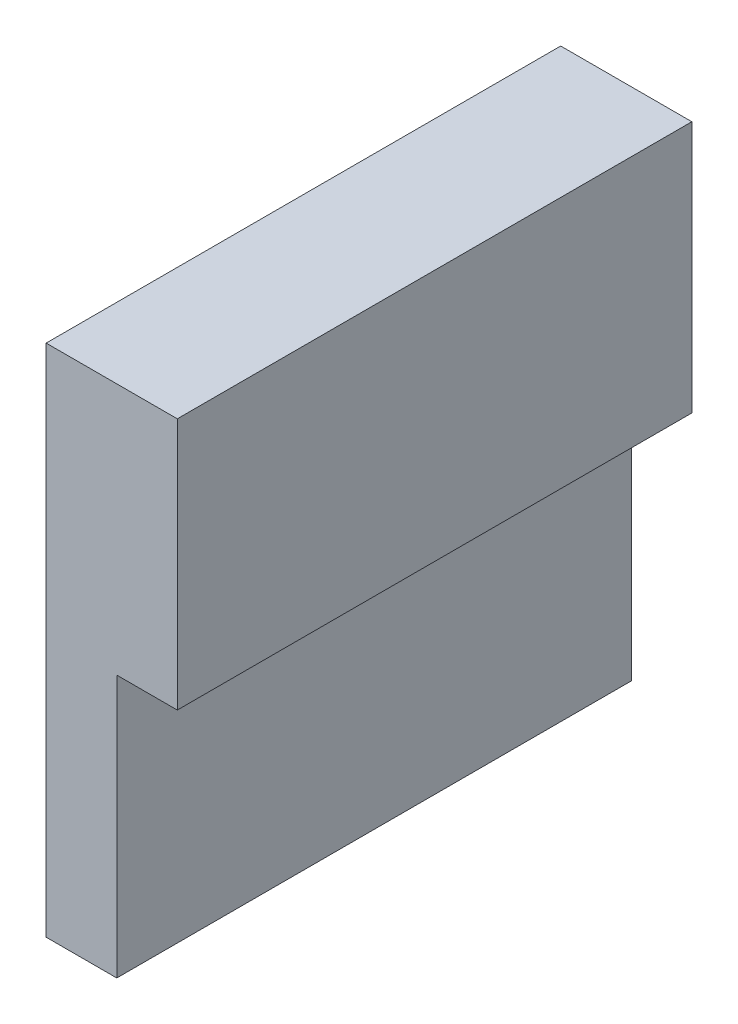
ISO-10303-21;
HEADER;
FILE_DESCRIPTION(('STEP AP214'),'2;1');
FILE_NAME('part.step','',(''),(''),'','','');
FILE_SCHEMA(('AUTOMOTIVE_DESIGN { 1 0 10303 214 1 1 1 1 }'));
ENDSEC;
DATA;
#1=APPLICATION_CONTEXT('core data for automotive mechanical design processes');
#2=APPLICATION_PROTOCOL_DEFINITION('international standard','automotive_design',2000,#1);
#3=PRODUCT_CONTEXT('',#1,'mechanical');
#4=PRODUCT('Part','Part','',(#3));
#5=PRODUCT_RELATED_PRODUCT_CATEGORY('part','',(#4));
#6=PRODUCT_DEFINITION_FORMATION('','',#4);
#7=PRODUCT_DEFINITION_CONTEXT('part definition',#1,'design');
#8=PRODUCT_DEFINITION('design','',#6,#7);
#9=PRODUCT_DEFINITION_SHAPE('','',#8);
#10=(LENGTH_UNIT() NAMED_UNIT(*) SI_UNIT(.MILLI.,.METRE.));
#11=(NAMED_UNIT(*) PLANE_ANGLE_UNIT() SI_UNIT($,.RADIAN.));
#12=(NAMED_UNIT(*) SI_UNIT($,.STERADIAN.) SOLID_ANGLE_UNIT());
#13=UNCERTAINTY_MEASURE_WITH_UNIT(LENGTH_MEASURE(1.E-05),#10,'distance_accuracy_value','');
#14=(GEOMETRIC_REPRESENTATION_CONTEXT(3) GLOBAL_UNCERTAINTY_ASSIGNED_CONTEXT((#13)) GLOBAL_UNIT_ASSIGNED_CONTEXT((#10,
#11,#12)) REPRESENTATION_CONTEXT('',''));
#15=CARTESIAN_POINT('',(0.,0.,0.));
#16=DIRECTION('',(0.,0.,1.));
#17=DIRECTION('',(1.,0.,0.));
#18=AXIS2_PLACEMENT_3D('',#15,#16,#17);
#19=CARTESIAN_POINT('',(13.,0.,0.));
#20=DIRECTION('',(0.,0.,1.));
#21=DIRECTION('',(0.,-1.,0.));
#22=AXIS2_PLACEMENT_3D('',#19,#20,#21);
#23=PLANE('',#22);
#24=DIRECTION('',(0.,1.,0.));
#25=VECTOR('',#24,1.);
#26=CARTESIAN_POINT('',(13.,0.,0.));
#27=LINE('',#26,#25);
#28=CARTESIAN_POINT('',(13.,-25.,0.));
#29=VERTEX_POINT('',#28);
#30=CARTESIAN_POINT('',(13.,0.,0.));
#31=VERTEX_POINT('',#30);
#32=EDGE_CURVE('E105',#29,#31,#27,.T.);
#33=ORIENTED_EDGE('',*,*,#32,.F.);
#34=DIRECTION('',(1.,0.,0.));
#35=VECTOR('',#34,1.);
#36=CARTESIAN_POINT('',(7.,-25.,0.));
#37=LINE('',#36,#35);
#38=CARTESIAN_POINT('',(7.,-25.,0.));
#39=VERTEX_POINT('',#38);
#40=EDGE_CURVE('E53',#39,#29,#37,.T.);
#41=ORIENTED_EDGE('',*,*,#40,.F.);
#42=DIRECTION('',(0.,1.,0.));
#43=VECTOR('',#42,1.);
#44=CARTESIAN_POINT('',(7.,-51.,0.));
#45=LINE('',#44,#43);
#46=CARTESIAN_POINT('',(7.,-51.,0.));
#47=VERTEX_POINT('',#46);
#48=EDGE_CURVE('E90',#47,#39,#45,.T.);
#49=ORIENTED_EDGE('',*,*,#48,.F.);
#50=DIRECTION('',(-1.,0.,0.));
#51=VECTOR('',#50,1.);
#52=CARTESIAN_POINT('',(13.,-51.,0.));
#53=LINE('',#52,#51);
#54=CARTESIAN_POINT('',(0.,-51.,0.));
#55=VERTEX_POINT('',#54);
#56=EDGE_CURVE('E82',#47,#55,#53,.T.);
#57=ORIENTED_EDGE('',*,*,#56,.T.);
#58=DIRECTION('',(0.,1.,0.));
#59=VECTOR('',#58,1.);
#60=CARTESIAN_POINT('',(0.,0.,0.));
#61=LINE('',#60,#59);
#62=CARTESIAN_POINT('',(0.,0.,0.));
#63=VERTEX_POINT('',#62);
#64=EDGE_CURVE('E87',#55,#63,#61,.T.);
#65=ORIENTED_EDGE('',*,*,#64,.T.);
#66=DIRECTION('',(-1.,0.,0.));
#67=VECTOR('',#66,1.);
#68=CARTESIAN_POINT('',(13.,0.,0.));
#69=LINE('',#68,#67);
#70=EDGE_CURVE('E11',#31,#63,#69,.T.);
#71=ORIENTED_EDGE('',*,*,#70,.F.);
#72=EDGE_LOOP('',(#33,#41,#49,#57,#65,#71));
#73=FACE_BOUND('',#72,.T.);
#74=ADVANCED_FACE('F38',(#73),#23,.F.);
#75=CARTESIAN_POINT('',(13.,0.,0.));
#76=DIRECTION('',(0.,-1.,0.));
#77=DIRECTION('',(0.,0.,-1.));
#78=AXIS2_PLACEMENT_3D('',#75,#76,#77);
#79=PLANE('',#78);
#80=DIRECTION('',(0.,0.,1.));
#81=VECTOR('',#80,1.);
#82=CARTESIAN_POINT('',(0.,0.,0.));
#83=LINE('',#82,#81);
#84=CARTESIAN_POINT('',(0.,0.,51.));
#85=VERTEX_POINT('',#84);
#86=EDGE_CURVE('E109',#63,#85,#83,.T.);
#87=ORIENTED_EDGE('',*,*,#86,.T.);
#88=DIRECTION('',(-1.,0.,0.));
#89=VECTOR('',#88,1.);
#90=CARTESIAN_POINT('',(13.,0.,51.));
#91=LINE('',#90,#89);
#92=CARTESIAN_POINT('',(13.,0.,51.));
#93=VERTEX_POINT('',#92);
#94=EDGE_CURVE('E46',#93,#85,#91,.T.);
#95=ORIENTED_EDGE('',*,*,#94,.F.);
#96=DIRECTION('',(0.,0.,1.));
#97=VECTOR('',#96,1.);
#98=CARTESIAN_POINT('',(13.,0.,0.));
#99=LINE('',#98,#97);
#100=EDGE_CURVE('E62',#31,#93,#99,.T.);
#101=ORIENTED_EDGE('',*,*,#100,.F.);
#102=ORIENTED_EDGE('',*,*,#70,.T.);
#103=EDGE_LOOP('',(#87,#95,#101,#102));
#104=FACE_BOUND('',#103,.T.);
#105=ADVANCED_FACE('F131',(#104),#79,.F.);
#106=CARTESIAN_POINT('',(13.,0.,51.));
#107=DIRECTION('',(0.,0.,-1.));
#108=DIRECTION('',(-1.,0.,0.));
#109=AXIS2_PLACEMENT_3D('',#106,#107,#108);
#110=PLANE('',#109);
#111=DIRECTION('',(0.,-1.,0.));
#112=VECTOR('',#111,1.);
#113=CARTESIAN_POINT('',(7.,-51.,51.));
#114=LINE('',#113,#112);
#115=CARTESIAN_POINT('',(7.,-25.,51.));
#116=VERTEX_POINT('',#115);
#117=CARTESIAN_POINT('',(7.,-51.,51.));
#118=VERTEX_POINT('',#117);
#119=EDGE_CURVE('E143',#116,#118,#114,.T.);
#120=ORIENTED_EDGE('',*,*,#119,.F.);
#121=DIRECTION('',(1.,0.,0.));
#122=VECTOR('',#121,1.);
#123=CARTESIAN_POINT('',(7.,-25.,51.));
#124=LINE('',#123,#122);
#125=CARTESIAN_POINT('',(13.,-25.,51.));
#126=VERTEX_POINT('',#125);
#127=EDGE_CURVE('E111',#116,#126,#124,.T.);
#128=ORIENTED_EDGE('',*,*,#127,.T.);
#129=DIRECTION('',(0.,-1.,0.));
#130=VECTOR('',#129,1.);
#131=CARTESIAN_POINT('',(13.,0.,51.));
#132=LINE('',#131,#130);
#133=EDGE_CURVE('E95',#93,#126,#132,.T.);
#134=ORIENTED_EDGE('',*,*,#133,.F.);
#135=ORIENTED_EDGE('',*,*,#94,.T.);
#136=DIRECTION('',(0.,-1.,0.));
#137=VECTOR('',#136,1.);
#138=CARTESIAN_POINT('',(0.,0.,51.));
#139=LINE('',#138,#137);
#140=CARTESIAN_POINT('',(0.,-51.,51.));
#141=VERTEX_POINT('',#140);
#142=EDGE_CURVE('E106',#85,#141,#139,.T.);
#143=ORIENTED_EDGE('',*,*,#142,.T.);
#144=DIRECTION('',(-1.,0.,0.));
#145=VECTOR('',#144,1.);
#146=CARTESIAN_POINT('',(13.,-51.,51.));
#147=LINE('',#146,#145);
#148=EDGE_CURVE('E94',#118,#141,#147,.T.);
#149=ORIENTED_EDGE('',*,*,#148,.F.);
#150=EDGE_LOOP('',(#120,#128,#134,#135,#143,#149));
#151=FACE_BOUND('',#150,.T.);
#152=ADVANCED_FACE('F129',(#151),#110,.F.);
#153=CARTESIAN_POINT('',(13.,-51.,0.));
#154=DIRECTION('',(0.,1.,0.));
#155=DIRECTION('',(0.,0.,1.));
#156=AXIS2_PLACEMENT_3D('',#153,#154,#155);
#157=PLANE('',#156);
#158=ORIENTED_EDGE('',*,*,#56,.F.);
#159=DIRECTION('',(0.,0.,-1.));
#160=VECTOR('',#159,1.);
#161=CARTESIAN_POINT('',(7.,-51.,51.));
#162=LINE('',#161,#160);
#163=EDGE_CURVE('E149',#118,#47,#162,.T.);
#164=ORIENTED_EDGE('',*,*,#163,.F.);
#165=ORIENTED_EDGE('',*,*,#148,.T.);
#166=DIRECTION('',(0.,0.,-1.));
#167=VECTOR('',#166,1.);
#168=CARTESIAN_POINT('',(0.,-51.,0.));
#169=LINE('',#168,#167);
#170=EDGE_CURVE('E98',#141,#55,#169,.T.);
#171=ORIENTED_EDGE('',*,*,#170,.T.);
#172=EDGE_LOOP('',(#158,#164,#165,#171));
#173=FACE_BOUND('',#172,.T.);
#174=ADVANCED_FACE('F99',(#173),#157,.F.);
#175=CARTESIAN_POINT('',(13.,0.,0.));
#176=DIRECTION('',(-1.,0.,0.));
#177=DIRECTION('',(0.,0.,1.));
#178=AXIS2_PLACEMENT_3D('',#175,#176,#177);
#179=PLANE('',#178);
#180=ORIENTED_EDGE('',*,*,#133,.T.);
#181=DIRECTION('',(0.,0.,1.));
#182=VECTOR('',#181,1.);
#183=CARTESIAN_POINT('',(13.,-25.,51.));
#184=LINE('',#183,#182);
#185=EDGE_CURVE('E140',#29,#126,#184,.T.);
#186=ORIENTED_EDGE('',*,*,#185,.F.);
#187=ORIENTED_EDGE('',*,*,#32,.T.);
#188=ORIENTED_EDGE('',*,*,#100,.T.);
#189=EDGE_LOOP('',(#180,#186,#187,#188));
#190=FACE_BOUND('',#189,.T.);
#191=ADVANCED_FACE('F165',(#190),#179,.F.);
#192=CARTESIAN_POINT('',(0.,0.,0.));
#193=DIRECTION('',(-1.,0.,0.));
#194=DIRECTION('',(0.,0.,1.));
#195=AXIS2_PLACEMENT_3D('',#192,#193,#194);
#196=PLANE('',#195);
#197=ORIENTED_EDGE('',*,*,#64,.F.);
#198=ORIENTED_EDGE('',*,*,#170,.F.);
#199=ORIENTED_EDGE('',*,*,#142,.F.);
#200=ORIENTED_EDGE('',*,*,#86,.F.);
#201=EDGE_LOOP('',(#197,#198,#199,#200));
#202=FACE_BOUND('',#201,.T.);
#203=ADVANCED_FACE('F108',(#202),#196,.T.);
#204=CARTESIAN_POINT('',(7.,-25.,51.));
#205=DIRECTION('',(0.,1.,0.));
#206=DIRECTION('',(0.,0.,1.));
#207=AXIS2_PLACEMENT_3D('',#204,#205,#206);
#208=PLANE('',#207);
#209=ORIENTED_EDGE('',*,*,#185,.T.);
#210=ORIENTED_EDGE('',*,*,#127,.F.);
#211=DIRECTION('',(0.,0.,1.));
#212=VECTOR('',#211,1.);
#213=CARTESIAN_POINT('',(7.,-25.,51.));
#214=LINE('',#213,#212);
#215=EDGE_CURVE('E138',#39,#116,#214,.T.);
#216=ORIENTED_EDGE('',*,*,#215,.F.);
#217=ORIENTED_EDGE('',*,*,#40,.T.);
#218=EDGE_LOOP('',(#209,#210,#216,#217));
#219=FACE_BOUND('',#218,.T.);
#220=ADVANCED_FACE('F164',(#219),#208,.F.);
#221=CARTESIAN_POINT('',(7.,0.,0.));
#222=DIRECTION('',(-1.,0.,0.));
#223=DIRECTION('',(0.,0.,1.));
#224=AXIS2_PLACEMENT_3D('',#221,#222,#223);
#225=PLANE('',#224);
#226=ORIENTED_EDGE('',*,*,#119,.T.);
#227=ORIENTED_EDGE('',*,*,#163,.T.);
#228=ORIENTED_EDGE('',*,*,#48,.T.);
#229=ORIENTED_EDGE('',*,*,#215,.T.);
#230=EDGE_LOOP('',(#226,#227,#228,#229));
#231=FACE_BOUND('',#230,.T.);
#232=ADVANCED_FACE('F157',(#231),#225,.F.);
#233=CLOSED_SHELL('',(#74,#105,#152,#174,#191,#203,#220,#232));
#234=MANIFOLD_SOLID_BREP('B2',#233);
#235=ADVANCED_BREP_SHAPE_REPRESENTATION('',(#18,#234),#14);
#236=SHAPE_DEFINITION_REPRESENTATION(#9,#235);
ENDSEC;
END-ISO-10303-21;
